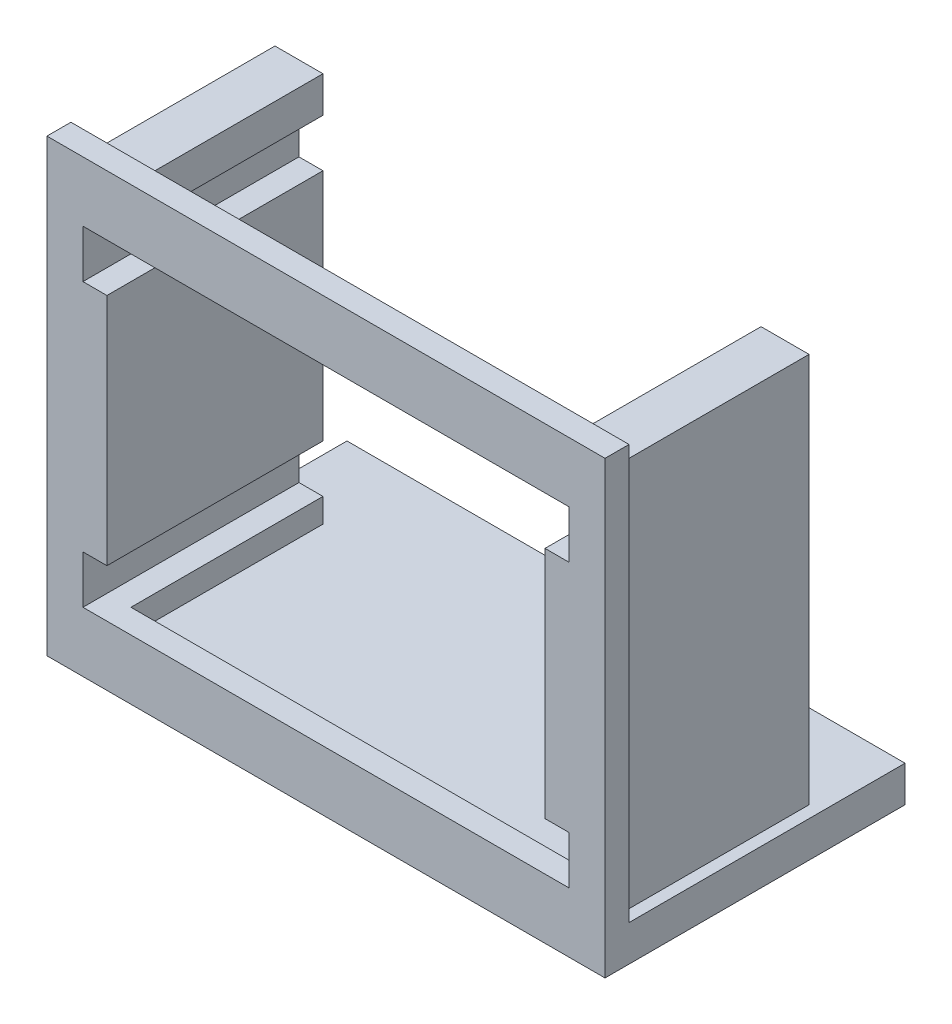
ISO-10303-21;
HEADER;
FILE_DESCRIPTION(('STEP AP214'),'2;1');
FILE_NAME('part.step','',(''),(''),'','','');
FILE_SCHEMA(('AUTOMOTIVE_DESIGN { 1 0 10303 214 1 1 1 1 }'));
ENDSEC;
DATA;
#1=APPLICATION_CONTEXT('core data for automotive mechanical design processes');
#2=APPLICATION_PROTOCOL_DEFINITION('international standard','automotive_design',2000,#1);
#3=PRODUCT_CONTEXT('',#1,'mechanical');
#4=PRODUCT('Part','Part','',(#3));
#5=PRODUCT_RELATED_PRODUCT_CATEGORY('part','',(#4));
#6=PRODUCT_DEFINITION_FORMATION('','',#4);
#7=PRODUCT_DEFINITION_CONTEXT('part definition',#1,'design');
#8=PRODUCT_DEFINITION('design','',#6,#7);
#9=PRODUCT_DEFINITION_SHAPE('','',#8);
#10=(LENGTH_UNIT() NAMED_UNIT(*) SI_UNIT(.MILLI.,.METRE.));
#11=(NAMED_UNIT(*) PLANE_ANGLE_UNIT() SI_UNIT($,.RADIAN.));
#12=(NAMED_UNIT(*) SI_UNIT($,.STERADIAN.) SOLID_ANGLE_UNIT());
#13=UNCERTAINTY_MEASURE_WITH_UNIT(LENGTH_MEASURE(1.E-05),#10,'distance_accuracy_value','');
#14=(GEOMETRIC_REPRESENTATION_CONTEXT(3) GLOBAL_UNCERTAINTY_ASSIGNED_CONTEXT((#13)) GLOBAL_UNIT_ASSIGNED_CONTEXT((#10,
#11,#12)) REPRESENTATION_CONTEXT('',''));
#15=CARTESIAN_POINT('',(0.,0.,0.));
#16=DIRECTION('',(0.,0.,1.));
#17=DIRECTION('',(1.,0.,0.));
#18=AXIS2_PLACEMENT_3D('',#15,#16,#17);
#19=CARTESIAN_POINT('',(-23.25,11.99,50.));
#20=DIRECTION('',(0.,0.,-1.));
#21=DIRECTION('',(-1.,0.,0.));
#22=AXIS2_PLACEMENT_3D('',#19,#20,#21);
#23=PLANE('',#22);
#24=DIRECTION('',(1.,0.,0.));
#25=VECTOR('',#24,1.);
#26=CARTESIAN_POINT('',(-23.25,12.,50.));
#27=LINE('',#26,#25);
#28=CARTESIAN_POINT('',(-23.25,12.,50.));
#29=VERTEX_POINT('',#28);
#30=CARTESIAN_POINT('',(23.25,12.,50.));
#31=VERTEX_POINT('',#30);
#32=EDGE_CURVE('E619',#29,#31,#27,.T.);
#33=ORIENTED_EDGE('',*,*,#32,.F.);
#34=DIRECTION('',(0.,-1.,0.));
#35=VECTOR('',#34,1.);
#36=CARTESIAN_POINT('',(-23.25,49.5,50.));
#37=LINE('',#36,#35);
#38=CARTESIAN_POINT('',(-23.25,15.,50.));
#39=VERTEX_POINT('',#38);
#40=EDGE_CURVE('E610',#39,#29,#37,.T.);
#41=ORIENTED_EDGE('',*,*,#40,.F.);
#42=DIRECTION('',(-1.,0.,0.));
#43=VECTOR('',#42,1.);
#44=CARTESIAN_POINT('',(0.,15.,50.));
#45=LINE('',#44,#43);
#46=CARTESIAN_POINT('',(23.25,15.,50.));
#47=VERTEX_POINT('',#46);
#48=EDGE_CURVE('E632',#47,#39,#45,.T.);
#49=ORIENTED_EDGE('',*,*,#48,.F.);
#50=DIRECTION('',(0.,1.,0.));
#51=VECTOR('',#50,1.);
#52=CARTESIAN_POINT('',(23.25,49.5,50.));
#53=LINE('',#52,#51);
#54=EDGE_CURVE('E618',#31,#47,#53,.T.);
#55=ORIENTED_EDGE('',*,*,#54,.F.);
#56=EDGE_LOOP('',(#33,#41,#49,#55));
#57=FACE_BOUND('',#56,.T.);
#58=ADVANCED_FACE('F409',(#57),#23,.T.);
#59=CARTESIAN_POINT('',(23.25,49.5,-75.01));
#60=DIRECTION('',(1.,0.,0.));
#61=DIRECTION('',(0.,0.,-1.));
#62=AXIS2_PLACEMENT_3D('',#59,#60,#61);
#63=PLANE('',#62);
#64=DIRECTION('',(0.,0.,1.));
#65=VECTOR('',#64,1.);
#66=CARTESIAN_POINT('',(23.25,12.,-75.01));
#67=LINE('',#66,#65);
#68=CARTESIAN_POINT('',(23.25,12.,75.));
#69=VERTEX_POINT('',#68);
#70=EDGE_CURVE('E631',#31,#69,#67,.T.);
#71=ORIENTED_EDGE('',*,*,#70,.F.);
#72=ORIENTED_EDGE('',*,*,#54,.T.);
#73=DIRECTION('',(0.,0.,-1.));
#74=VECTOR('',#73,1.);
#75=CARTESIAN_POINT('',(23.25,15.,0.));
#76=LINE('',#75,#74);
#77=CARTESIAN_POINT('',(23.25,15.,73.));
#78=VERTEX_POINT('',#77);
#79=EDGE_CURVE('E413',#78,#47,#76,.T.);
#80=ORIENTED_EDGE('',*,*,#79,.F.);
#81=DIRECTION('',(0.,-1.,0.));
#82=VECTOR('',#81,1.);
#83=CARTESIAN_POINT('',(23.25,80.,73.));
#84=LINE('',#83,#82);
#85=CARTESIAN_POINT('',(23.25,49.5,73.));
#86=VERTEX_POINT('',#85);
#87=EDGE_CURVE('E644',#86,#78,#84,.T.);
#88=ORIENTED_EDGE('',*,*,#87,.F.);
#89=DIRECTION('',(0.,0.,1.));
#90=VECTOR('',#89,1.);
#91=CARTESIAN_POINT('',(23.25,49.5,-75.01));
#92=LINE('',#91,#90);
#93=CARTESIAN_POINT('',(23.25,49.5,75.));
#94=VERTEX_POINT('',#93);
#95=EDGE_CURVE('E427',#86,#94,#92,.T.);
#96=ORIENTED_EDGE('',*,*,#95,.T.);
#97=DIRECTION('',(0.,-1.,0.));
#98=VECTOR('',#97,1.);
#99=CARTESIAN_POINT('',(23.25,80.,75.));
#100=LINE('',#99,#98);
#101=EDGE_CURVE('E649',#94,#69,#100,.T.);
#102=ORIENTED_EDGE('',*,*,#101,.T.);
#103=EDGE_LOOP('',(#71,#72,#80,#88,#96,#102));
#104=FACE_BOUND('',#103,.T.);
#105=ADVANCED_FACE('F921',(#104),#63,.T.);
#106=CARTESIAN_POINT('',(-18.25,44.5,27.2998905909406));
#107=DIRECTION('',(-1.,0.,0.));
#108=DIRECTION('',(0.,-1.,0.));
#109=AXIS2_PLACEMENT_3D('',#106,#107,#108);
#110=PLANE('',#109);
#111=DIRECTION('',(0.,0.,1.));
#112=VECTOR('',#111,1.);
#113=CARTESIAN_POINT('',(-18.25,40.5,27.2998905909406));
#114=LINE('',#113,#112);
#115=CARTESIAN_POINT('',(-18.25,40.5,57.));
#116=VERTEX_POINT('',#115);
#117=CARTESIAN_POINT('',(-18.25,40.5,75.));
#118=VERTEX_POINT('',#117);
#119=EDGE_CURVE('E863',#116,#118,#114,.T.);
#120=ORIENTED_EDGE('',*,*,#119,.T.);
#121=DIRECTION('',(0.,-1.,0.));
#122=VECTOR('',#121,1.);
#123=CARTESIAN_POINT('',(-18.25,44.5,75.));
#124=LINE('',#123,#122);
#125=CARTESIAN_POINT('',(-18.25,21.,75.));
#126=VERTEX_POINT('',#125);
#127=EDGE_CURVE('E838',#118,#126,#124,.T.);
#128=ORIENTED_EDGE('',*,*,#127,.T.);
#129=DIRECTION('',(0.,0.,1.));
#130=VECTOR('',#129,1.);
#131=CARTESIAN_POINT('',(-18.25,21.,27.2998905909406));
#132=LINE('',#131,#130);
#133=CARTESIAN_POINT('',(-18.25,21.,57.));
#134=VERTEX_POINT('',#133);
#135=EDGE_CURVE('E829',#134,#126,#132,.T.);
#136=ORIENTED_EDGE('',*,*,#135,.F.);
#137=DIRECTION('',(0.,-1.,0.));
#138=VECTOR('',#137,1.);
#139=CARTESIAN_POINT('',(-18.25,21.,57.));
#140=LINE('',#139,#138);
#141=EDGE_CURVE('E682',#116,#134,#140,.T.);
#142=ORIENTED_EDGE('',*,*,#141,.F.);
#143=EDGE_LOOP('',(#120,#128,#136,#142));
#144=FACE_BOUND('',#143,.T.);
#145=ADVANCED_FACE('F1000',(#144),#110,.F.);
#146=CARTESIAN_POINT('',(-20.25,40.5,27.2998905909406));
#147=DIRECTION('',(0.,-1.,0.));
#148=DIRECTION('',(0.,0.,-1.));
#149=AXIS2_PLACEMENT_3D('',#146,#147,#148);
#150=PLANE('',#149);
#151=DIRECTION('',(0.,0.,1.));
#152=VECTOR('',#151,1.);
#153=CARTESIAN_POINT('',(-20.25,40.5,27.2998905909406));
#154=LINE('',#153,#152);
#155=CARTESIAN_POINT('',(-20.25,40.5,57.));
#156=VERTEX_POINT('',#155);
#157=CARTESIAN_POINT('',(-20.25,40.5,75.));
#158=VERTEX_POINT('',#157);
#159=EDGE_CURVE('E849',#156,#158,#154,.T.);
#160=ORIENTED_EDGE('',*,*,#159,.T.);
#161=DIRECTION('',(1.,0.,0.));
#162=VECTOR('',#161,1.);
#163=CARTESIAN_POINT('',(-20.25,40.5,75.));
#164=LINE('',#163,#162);
#165=EDGE_CURVE('E850',#158,#118,#164,.T.);
#166=ORIENTED_EDGE('',*,*,#165,.T.);
#167=ORIENTED_EDGE('',*,*,#119,.F.);
#168=DIRECTION('',(1.,0.,0.));
#169=VECTOR('',#168,1.);
#170=CARTESIAN_POINT('',(-18.25,40.5,57.));
#171=LINE('',#170,#169);
#172=EDGE_CURVE('E678',#156,#116,#171,.T.);
#173=ORIENTED_EDGE('',*,*,#172,.F.);
#174=EDGE_LOOP('',(#160,#166,#167,#173));
#175=FACE_BOUND('',#174,.T.);
#176=ADVANCED_FACE('F995',(#175),#150,.F.);
#177=CARTESIAN_POINT('',(-20.25,44.5,27.2998905909406));
#178=DIRECTION('',(-1.,0.,0.));
#179=DIRECTION('',(0.,0.,1.));
#180=AXIS2_PLACEMENT_3D('',#177,#178,#179);
#181=PLANE('',#180);
#182=DIRECTION('',(0.,0.,1.));
#183=VECTOR('',#182,1.);
#184=CARTESIAN_POINT('',(-20.25,44.5,27.2998905909406));
#185=LINE('',#184,#183);
#186=CARTESIAN_POINT('',(-20.25,44.5,57.));
#187=VERTEX_POINT('',#186);
#188=CARTESIAN_POINT('',(-20.25,44.5,75.));
#189=VERTEX_POINT('',#188);
#190=EDGE_CURVE('E854',#187,#189,#185,.T.);
#191=ORIENTED_EDGE('',*,*,#190,.T.);
#192=DIRECTION('',(0.,-1.,0.));
#193=VECTOR('',#192,1.);
#194=CARTESIAN_POINT('',(-20.25,44.5,75.));
#195=LINE('',#194,#193);
#196=EDGE_CURVE('E855',#189,#158,#195,.T.);
#197=ORIENTED_EDGE('',*,*,#196,.T.);
#198=ORIENTED_EDGE('',*,*,#159,.F.);
#199=DIRECTION('',(0.,-1.,0.));
#200=VECTOR('',#199,1.);
#201=CARTESIAN_POINT('',(-20.25,40.5,57.));
#202=LINE('',#201,#200);
#203=EDGE_CURVE('E674',#187,#156,#202,.T.);
#204=ORIENTED_EDGE('',*,*,#203,.F.);
#205=EDGE_LOOP('',(#191,#197,#198,#204));
#206=FACE_BOUND('',#205,.T.);
#207=ADVANCED_FACE('F991',(#206),#181,.F.);
#208=CARTESIAN_POINT('',(20.25,44.5,27.2998905909406));
#209=DIRECTION('',(-1.,0.,0.));
#210=DIRECTION('',(0.,0.,1.));
#211=AXIS2_PLACEMENT_3D('',#208,#209,#210);
#212=PLANE('',#211);
#213=DIRECTION('',(0.,0.,1.));
#214=VECTOR('',#213,1.);
#215=CARTESIAN_POINT('',(20.25,44.5,27.2998905909406));
#216=LINE('',#215,#214);
#217=CARTESIAN_POINT('',(20.25,44.5,57.));
#218=VERTEX_POINT('',#217);
#219=CARTESIAN_POINT('',(20.25,44.5,75.));
#220=VERTEX_POINT('',#219);
#221=EDGE_CURVE('E893',#218,#220,#216,.T.);
#222=ORIENTED_EDGE('',*,*,#221,.F.);
#223=DIRECTION('',(0.,1.,0.));
#224=VECTOR('',#223,1.);
#225=CARTESIAN_POINT('',(20.25,44.5,57.));
#226=LINE('',#225,#224);
#227=CARTESIAN_POINT('',(20.25,40.5,57.));
#228=VERTEX_POINT('',#227);
#229=EDGE_CURVE('E777',#228,#218,#226,.T.);
#230=ORIENTED_EDGE('',*,*,#229,.F.);
#231=DIRECTION('',(0.,0.,1.));
#232=VECTOR('',#231,1.);
#233=CARTESIAN_POINT('',(20.25,40.5,27.2998905909406));
#234=LINE('',#233,#232);
#235=CARTESIAN_POINT('',(20.25,40.5,75.));
#236=VERTEX_POINT('',#235);
#237=EDGE_CURVE('E888',#228,#236,#234,.T.);
#238=ORIENTED_EDGE('',*,*,#237,.T.);
#239=DIRECTION('',(0.,-1.,0.));
#240=VECTOR('',#239,1.);
#241=CARTESIAN_POINT('',(20.25,44.5,75.));
#242=LINE('',#241,#240);
#243=EDGE_CURVE('E889',#220,#236,#242,.T.);
#244=ORIENTED_EDGE('',*,*,#243,.F.);
#245=EDGE_LOOP('',(#222,#230,#238,#244));
#246=FACE_BOUND('',#245,.T.);
#247=ADVANCED_FACE('F1029',(#246),#212,.T.);
#248=CARTESIAN_POINT('',(20.25,40.5,27.2998905909406));
#249=DIRECTION('',(0.,1.,0.));
#250=DIRECTION('',(0.,0.,1.));
#251=AXIS2_PLACEMENT_3D('',#248,#249,#250);
#252=PLANE('',#251);
#253=ORIENTED_EDGE('',*,*,#237,.F.);
#254=DIRECTION('',(1.,0.,0.));
#255=VECTOR('',#254,1.);
#256=CARTESIAN_POINT('',(20.25,40.5,57.));
#257=LINE('',#256,#255);
#258=CARTESIAN_POINT('',(18.25,40.5,57.));
#259=VERTEX_POINT('',#258);
#260=EDGE_CURVE('E772',#259,#228,#257,.T.);
#261=ORIENTED_EDGE('',*,*,#260,.F.);
#262=DIRECTION('',(0.,0.,1.));
#263=VECTOR('',#262,1.);
#264=CARTESIAN_POINT('',(18.25,40.5,27.2998905909406));
#265=LINE('',#264,#263);
#266=CARTESIAN_POINT('',(18.25,40.5,75.));
#267=VERTEX_POINT('',#266);
#268=EDGE_CURVE('E899',#259,#267,#265,.T.);
#269=ORIENTED_EDGE('',*,*,#268,.T.);
#270=DIRECTION('',(-1.,0.,0.));
#271=VECTOR('',#270,1.);
#272=CARTESIAN_POINT('',(20.25,40.5,75.));
#273=LINE('',#272,#271);
#274=EDGE_CURVE('E880',#236,#267,#273,.T.);
#275=ORIENTED_EDGE('',*,*,#274,.F.);
#276=EDGE_LOOP('',(#253,#261,#269,#275));
#277=FACE_BOUND('',#276,.T.);
#278=ADVANCED_FACE('F1026',(#277),#252,.T.);
#279=CARTESIAN_POINT('',(18.25,44.5,27.2998905909406));
#280=DIRECTION('',(-1.,0.,0.));
#281=DIRECTION('',(0.,0.,1.));
#282=AXIS2_PLACEMENT_3D('',#279,#280,#281);
#283=PLANE('',#282);
#284=ORIENTED_EDGE('',*,*,#268,.F.);
#285=DIRECTION('',(0.,1.,0.));
#286=VECTOR('',#285,1.);
#287=CARTESIAN_POINT('',(18.25,40.5,57.));
#288=LINE('',#287,#286);
#289=CARTESIAN_POINT('',(18.25,21.,57.));
#290=VERTEX_POINT('',#289);
#291=EDGE_CURVE('E788',#290,#259,#288,.T.);
#292=ORIENTED_EDGE('',*,*,#291,.F.);
#293=DIRECTION('',(0.,0.,1.));
#294=VECTOR('',#293,1.);
#295=CARTESIAN_POINT('',(18.25,21.,27.2998905909406));
#296=LINE('',#295,#294);
#297=CARTESIAN_POINT('',(18.25,21.,75.));
#298=VERTEX_POINT('',#297);
#299=EDGE_CURVE('E866',#290,#298,#296,.T.);
#300=ORIENTED_EDGE('',*,*,#299,.T.);
#301=DIRECTION('',(0.,-1.,0.));
#302=VECTOR('',#301,1.);
#303=CARTESIAN_POINT('',(18.25,44.5,75.));
#304=LINE('',#303,#302);
#305=EDGE_CURVE('E830',#267,#298,#304,.T.);
#306=ORIENTED_EDGE('',*,*,#305,.F.);
#307=EDGE_LOOP('',(#284,#292,#300,#306));
#308=FACE_BOUND('',#307,.T.);
#309=ADVANCED_FACE('F1023',(#308),#283,.T.);
#310=CARTESIAN_POINT('',(20.25,21.,27.2998905909406));
#311=DIRECTION('',(0.,1.,0.));
#312=DIRECTION('',(0.,0.,1.));
#313=AXIS2_PLACEMENT_3D('',#310,#311,#312);
#314=PLANE('',#313);
#315=DIRECTION('',(0.,0.,1.));
#316=VECTOR('',#315,1.);
#317=CARTESIAN_POINT('',(20.25,21.,27.2998905909406));
#318=LINE('',#317,#316);
#319=CARTESIAN_POINT('',(20.25,21.,57.));
#320=VERTEX_POINT('',#319);
#321=CARTESIAN_POINT('',(20.25,21.,75.));
#322=VERTEX_POINT('',#321);
#323=EDGE_CURVE('E908',#320,#322,#318,.T.);
#324=ORIENTED_EDGE('',*,*,#323,.T.);
#325=DIRECTION('',(-1.,0.,0.));
#326=VECTOR('',#325,1.);
#327=CARTESIAN_POINT('',(20.25,21.,75.));
#328=LINE('',#327,#326);
#329=EDGE_CURVE('E904',#322,#298,#328,.T.);
#330=ORIENTED_EDGE('',*,*,#329,.T.);
#331=ORIENTED_EDGE('',*,*,#299,.F.);
#332=DIRECTION('',(-1.,0.,0.));
#333=VECTOR('',#332,1.);
#334=CARTESIAN_POINT('',(18.25,21.,57.));
#335=LINE('',#334,#333);
#336=EDGE_CURVE('E792',#320,#290,#335,.T.);
#337=ORIENTED_EDGE('',*,*,#336,.F.);
#338=EDGE_LOOP('',(#324,#330,#331,#337));
#339=FACE_BOUND('',#338,.T.);
#340=ADVANCED_FACE('F1018',(#339),#314,.F.);
#341=CARTESIAN_POINT('',(20.25,17.,27.2998905909406));
#342=DIRECTION('',(1.,0.,0.));
#343=DIRECTION('',(0.,0.,-1.));
#344=AXIS2_PLACEMENT_3D('',#341,#342,#343);
#345=PLANE('',#344);
#346=DIRECTION('',(0.,0.,1.));
#347=VECTOR('',#346,1.);
#348=CARTESIAN_POINT('',(20.25,17.,27.2998905909406));
#349=LINE('',#348,#347);
#350=CARTESIAN_POINT('',(20.25,17.,57.));
#351=VERTEX_POINT('',#350);
#352=CARTESIAN_POINT('',(20.25,17.,75.));
#353=VERTEX_POINT('',#352);
#354=EDGE_CURVE('E896',#351,#353,#349,.T.);
#355=ORIENTED_EDGE('',*,*,#354,.T.);
#356=DIRECTION('',(0.,1.,0.));
#357=VECTOR('',#356,1.);
#358=CARTESIAN_POINT('',(20.25,17.,75.));
#359=LINE('',#358,#357);
#360=EDGE_CURVE('E750',#353,#322,#359,.T.);
#361=ORIENTED_EDGE('',*,*,#360,.T.);
#362=ORIENTED_EDGE('',*,*,#323,.F.);
#363=DIRECTION('',(0.,1.,0.));
#364=VECTOR('',#363,1.);
#365=CARTESIAN_POINT('',(20.25,21.,57.));
#366=LINE('',#365,#364);
#367=EDGE_CURVE('E796',#351,#320,#366,.T.);
#368=ORIENTED_EDGE('',*,*,#367,.F.);
#369=EDGE_LOOP('',(#355,#361,#362,#368));
#370=FACE_BOUND('',#369,.T.);
#371=ADVANCED_FACE('F1013',(#370),#345,.F.);
#372=CARTESIAN_POINT('',(-20.25,21.,27.2998905909406));
#373=DIRECTION('',(0.,-1.,0.));
#374=DIRECTION('',(0.,0.,-1.));
#375=AXIS2_PLACEMENT_3D('',#372,#373,#374);
#376=PLANE('',#375);
#377=DIRECTION('',(0.,0.,1.));
#378=VECTOR('',#377,1.);
#379=CARTESIAN_POINT('',(-20.25,21.,27.2998905909406));
#380=LINE('',#379,#378);
#381=CARTESIAN_POINT('',(-20.25,21.,57.));
#382=VERTEX_POINT('',#381);
#383=CARTESIAN_POINT('',(-20.25,21.,75.));
#384=VERTEX_POINT('',#383);
#385=EDGE_CURVE('E872',#382,#384,#380,.T.);
#386=ORIENTED_EDGE('',*,*,#385,.F.);
#387=DIRECTION('',(-1.,0.,0.));
#388=VECTOR('',#387,1.);
#389=CARTESIAN_POINT('',(-20.25,21.,57.));
#390=LINE('',#389,#388);
#391=EDGE_CURVE('E686',#134,#382,#390,.T.);
#392=ORIENTED_EDGE('',*,*,#391,.F.);
#393=ORIENTED_EDGE('',*,*,#135,.T.);
#394=DIRECTION('',(1.,0.,0.));
#395=VECTOR('',#394,1.);
#396=CARTESIAN_POINT('',(-20.25,21.,75.));
#397=LINE('',#396,#395);
#398=EDGE_CURVE('E859',#384,#126,#397,.T.);
#399=ORIENTED_EDGE('',*,*,#398,.F.);
#400=EDGE_LOOP('',(#386,#392,#393,#399));
#401=FACE_BOUND('',#400,.T.);
#402=ADVANCED_FACE('F1003',(#401),#376,.T.);
#403=CARTESIAN_POINT('',(0.,0.,57.));
#404=DIRECTION('',(0.,0.,-1.));
#405=DIRECTION('',(-1.,0.,0.));
#406=AXIS2_PLACEMENT_3D('',#403,#404,#405);
#407=PLANE('',#406);
#408=ORIENTED_EDGE('',*,*,#229,.T.);
#409=DIRECTION('',(-1.,0.,0.));
#410=VECTOR('',#409,1.);
#411=CARTESIAN_POINT('',(18.25,44.5,57.));
#412=LINE('',#411,#410);
#413=CARTESIAN_POINT('',(18.25,44.5,57.));
#414=VERTEX_POINT('',#413);
#415=EDGE_CURVE('E819',#218,#414,#412,.T.);
#416=ORIENTED_EDGE('',*,*,#415,.T.);
#417=DIRECTION('',(0.,1.,0.));
#418=VECTOR('',#417,1.);
#419=CARTESIAN_POINT('',(18.25,47.5,57.));
#420=LINE('',#419,#418);
#421=CARTESIAN_POINT('',(18.25,47.5,57.));
#422=VERTEX_POINT('',#421);
#423=EDGE_CURVE('E816',#414,#422,#420,.T.);
#424=ORIENTED_EDGE('',*,*,#423,.T.);
#425=DIRECTION('',(1.,0.,0.));
#426=VECTOR('',#425,1.);
#427=CARTESIAN_POINT('',(22.25,47.5,57.));
#428=LINE('',#427,#426);
#429=CARTESIAN_POINT('',(22.25,47.5,57.));
#430=VERTEX_POINT('',#429);
#431=EDGE_CURVE('E813',#422,#430,#428,.T.);
#432=ORIENTED_EDGE('',*,*,#431,.T.);
#433=DIRECTION('',(0.,-1.,0.));
#434=VECTOR('',#433,1.);
#435=CARTESIAN_POINT('',(22.25,47.5,57.));
#436=LINE('',#435,#434);
#437=CARTESIAN_POINT('',(22.25,15.,57.));
#438=VERTEX_POINT('',#437);
#439=EDGE_CURVE('E810',#430,#438,#436,.T.);
#440=ORIENTED_EDGE('',*,*,#439,.T.);
#441=DIRECTION('',(-1.,0.,0.));
#442=VECTOR('',#441,1.);
#443=CARTESIAN_POINT('',(18.25,15.,57.));
#444=LINE('',#443,#442);
#445=CARTESIAN_POINT('',(18.25,15.,57.));
#446=VERTEX_POINT('',#445);
#447=EDGE_CURVE('E807',#438,#446,#444,.T.);
#448=ORIENTED_EDGE('',*,*,#447,.T.);
#449=DIRECTION('',(0.,1.,0.));
#450=VECTOR('',#449,1.);
#451=CARTESIAN_POINT('',(18.25,17.,57.));
#452=LINE('',#451,#450);
#453=CARTESIAN_POINT('',(18.25,17.,57.));
#454=VERTEX_POINT('',#453);
#455=EDGE_CURVE('E804',#446,#454,#452,.T.);
#456=ORIENTED_EDGE('',*,*,#455,.T.);
#457=DIRECTION('',(1.,0.,0.));
#458=VECTOR('',#457,1.);
#459=CARTESIAN_POINT('',(20.25,17.,57.));
#460=LINE('',#459,#458);
#461=EDGE_CURVE('E800',#454,#351,#460,.T.);
#462=ORIENTED_EDGE('',*,*,#461,.T.);
#463=ORIENTED_EDGE('',*,*,#367,.T.);
#464=ORIENTED_EDGE('',*,*,#336,.T.);
#465=ORIENTED_EDGE('',*,*,#291,.T.);
#466=ORIENTED_EDGE('',*,*,#260,.T.);
#467=EDGE_LOOP('',(#408,#416,#424,#432,#440,#448,#456,#462,#463,#464,#465,#466));
#468=FACE_BOUND('',#467,.T.);
#469=ADVANCED_FACE('F964',(#468),#407,.T.);
#470=CARTESIAN_POINT('',(18.25,17.,57.));
#471=DIRECTION('',(1.,0.,0.));
#472=DIRECTION('',(0.,1.,0.));
#473=AXIS2_PLACEMENT_3D('',#470,#471,#472);
#474=PLANE('',#473);
#475=DIRECTION('',(0.,1.,0.));
#476=VECTOR('',#475,1.);
#477=CARTESIAN_POINT('',(18.25,17.,73.));
#478=LINE('',#477,#476);
#479=CARTESIAN_POINT('',(18.25,15.,73.));
#480=VERTEX_POINT('',#479);
#481=CARTESIAN_POINT('',(18.25,17.,73.));
#482=VERTEX_POINT('',#481);
#483=EDGE_CURVE('E773',#480,#482,#478,.T.);
#484=ORIENTED_EDGE('',*,*,#483,.T.);
#485=DIRECTION('',(0.,0.,1.));
#486=VECTOR('',#485,1.);
#487=CARTESIAN_POINT('',(18.25,17.,57.));
#488=LINE('',#487,#486);
#489=EDGE_CURVE('E768',#454,#482,#488,.T.);
#490=ORIENTED_EDGE('',*,*,#489,.F.);
#491=ORIENTED_EDGE('',*,*,#455,.F.);
#492=DIRECTION('',(0.,0.,1.));
#493=VECTOR('',#492,1.);
#494=CARTESIAN_POINT('',(18.25,15.,57.));
#495=LINE('',#494,#493);
#496=EDGE_CURVE('E765',#446,#480,#495,.T.);
#497=ORIENTED_EDGE('',*,*,#496,.T.);
#498=EDGE_LOOP('',(#484,#490,#491,#497));
#499=FACE_BOUND('',#498,.T.);
#500=ADVANCED_FACE('F962',(#499),#474,.F.);
#501=CARTESIAN_POINT('',(-100.,80.,73.));
#502=DIRECTION('',(0.,0.,-1.));
#503=DIRECTION('',(-1.,0.,0.));
#504=AXIS2_PLACEMENT_3D('',#501,#502,#503);
#505=PLANE('',#504);
#506=DIRECTION('',(1.,0.,0.));
#507=VECTOR('',#506,1.);
#508=CARTESIAN_POINT('',(-100.,15.,73.));
#509=LINE('',#508,#507);
#510=CARTESIAN_POINT('',(-18.25,15.,73.));
#511=VERTEX_POINT('',#510);
#512=EDGE_CURVE('E928',#511,#480,#509,.T.);
#513=ORIENTED_EDGE('',*,*,#512,.F.);
#514=DIRECTION('',(0.,-1.,0.));
#515=VECTOR('',#514,1.);
#516=CARTESIAN_POINT('',(-18.25,15.,73.));
#517=LINE('',#516,#515);
#518=CARTESIAN_POINT('',(-18.25,17.,73.));
#519=VERTEX_POINT('',#518);
#520=EDGE_CURVE('E716',#519,#511,#517,.T.);
#521=ORIENTED_EDGE('',*,*,#520,.F.);
#522=DIRECTION('',(1.,0.,0.));
#523=VECTOR('',#522,1.);
#524=CARTESIAN_POINT('',(-18.25,17.,73.));
#525=LINE('',#524,#523);
#526=EDGE_CURVE('E834',#519,#482,#525,.T.);
#527=ORIENTED_EDGE('',*,*,#526,.T.);
#528=ORIENTED_EDGE('',*,*,#483,.F.);
#529=EDGE_LOOP('',(#513,#521,#527,#528));
#530=FACE_BOUND('',#529,.T.);
#531=ADVANCED_FACE('F951',(#530),#505,.T.);
#532=CARTESIAN_POINT('',(-18.25,15.,57.));
#533=DIRECTION('',(-1.,0.,0.));
#534=DIRECTION('',(0.,-1.,0.));
#535=AXIS2_PLACEMENT_3D('',#532,#533,#534);
#536=PLANE('',#535);
#537=ORIENTED_EDGE('',*,*,#520,.T.);
#538=DIRECTION('',(0.,0.,1.));
#539=VECTOR('',#538,1.);
#540=CARTESIAN_POINT('',(-18.25,15.,57.));
#541=LINE('',#540,#539);
#542=CARTESIAN_POINT('',(-18.25,15.,57.));
#543=VERTEX_POINT('',#542);
#544=EDGE_CURVE('E739',#543,#511,#541,.T.);
#545=ORIENTED_EDGE('',*,*,#544,.F.);
#546=DIRECTION('',(0.,-1.,0.));
#547=VECTOR('',#546,1.);
#548=CARTESIAN_POINT('',(-18.25,15.,57.));
#549=LINE('',#548,#547);
#550=CARTESIAN_POINT('',(-18.25,17.,57.));
#551=VERTEX_POINT('',#550);
#552=EDGE_CURVE('E697',#551,#543,#549,.T.);
#553=ORIENTED_EDGE('',*,*,#552,.F.);
#554=DIRECTION('',(0.,0.,1.));
#555=VECTOR('',#554,1.);
#556=CARTESIAN_POINT('',(-18.25,17.,57.));
#557=LINE('',#556,#555);
#558=EDGE_CURVE('E742',#551,#519,#557,.T.);
#559=ORIENTED_EDGE('',*,*,#558,.T.);
#560=EDGE_LOOP('',(#537,#545,#553,#559));
#561=FACE_BOUND('',#560,.T.);
#562=ADVANCED_FACE('F953',(#561),#536,.F.);
#563=CARTESIAN_POINT('',(0.,0.,57.));
#564=DIRECTION('',(0.,0.,-1.));
#565=DIRECTION('',(-1.,0.,0.));
#566=AXIS2_PLACEMENT_3D('',#563,#564,#565);
#567=PLANE('',#566);
#568=DIRECTION('',(0.,-1.,0.));
#569=VECTOR('',#568,1.);
#570=CARTESIAN_POINT('',(-18.25,44.5,57.));
#571=LINE('',#570,#569);
#572=CARTESIAN_POINT('',(-18.25,47.5,57.));
#573=VERTEX_POINT('',#572);
#574=CARTESIAN_POINT('',(-18.25,44.5,57.));
#575=VERTEX_POINT('',#574);
#576=EDGE_CURVE('E665',#573,#575,#571,.T.);
#577=ORIENTED_EDGE('',*,*,#576,.T.);
#578=DIRECTION('',(-1.,0.,0.));
#579=VECTOR('',#578,1.);
#580=CARTESIAN_POINT('',(-20.25,44.5,57.));
#581=LINE('',#580,#579);
#582=EDGE_CURVE('E669',#575,#187,#581,.T.);
#583=ORIENTED_EDGE('',*,*,#582,.T.);
#584=ORIENTED_EDGE('',*,*,#203,.T.);
#585=ORIENTED_EDGE('',*,*,#172,.T.);
#586=ORIENTED_EDGE('',*,*,#141,.T.);
#587=ORIENTED_EDGE('',*,*,#391,.T.);
#588=DIRECTION('',(0.,-1.,0.));
#589=VECTOR('',#588,1.);
#590=CARTESIAN_POINT('',(-20.25,17.,57.));
#591=LINE('',#590,#589);
#592=CARTESIAN_POINT('',(-20.25,17.,57.));
#593=VERTEX_POINT('',#592);
#594=EDGE_CURVE('E690',#382,#593,#591,.T.);
#595=ORIENTED_EDGE('',*,*,#594,.T.);
#596=DIRECTION('',(1.,0.,0.));
#597=VECTOR('',#596,1.);
#598=CARTESIAN_POINT('',(-18.25,17.,57.));
#599=LINE('',#598,#597);
#600=EDGE_CURVE('E694',#593,#551,#599,.T.);
#601=ORIENTED_EDGE('',*,*,#600,.T.);
#602=ORIENTED_EDGE('',*,*,#552,.T.);
#603=DIRECTION('',(-1.,0.,0.));
#604=VECTOR('',#603,1.);
#605=CARTESIAN_POINT('',(-18.25,15.,57.));
#606=LINE('',#605,#604);
#607=CARTESIAN_POINT('',(-22.25,15.,57.));
#608=VERTEX_POINT('',#607);
#609=EDGE_CURVE('E701',#543,#608,#606,.T.);
#610=ORIENTED_EDGE('',*,*,#609,.T.);
#611=DIRECTION('',(0.,1.,0.));
#612=VECTOR('',#611,1.);
#613=CARTESIAN_POINT('',(-22.25,47.5,57.));
#614=LINE('',#613,#612);
#615=CARTESIAN_POINT('',(-22.25,47.5,57.));
#616=VERTEX_POINT('',#615);
#617=EDGE_CURVE('E705',#608,#616,#614,.T.);
#618=ORIENTED_EDGE('',*,*,#617,.T.);
#619=DIRECTION('',(1.,0.,0.));
#620=VECTOR('',#619,1.);
#621=CARTESIAN_POINT('',(-22.25,47.5,57.));
#622=LINE('',#621,#620);
#623=EDGE_CURVE('E708',#616,#573,#622,.T.);
#624=ORIENTED_EDGE('',*,*,#623,.T.);
#625=EDGE_LOOP('',(#577,#583,#584,#585,#586,#587,#595,#601,#602,#610,#618,#624));
#626=FACE_BOUND('',#625,.T.);
#627=ADVANCED_FACE('F942',(#626),#567,.T.);
#628=CARTESIAN_POINT('',(-22.25,47.5,57.));
#629=DIRECTION('',(1.,0.,0.));
#630=DIRECTION('',(0.,1.,0.));
#631=AXIS2_PLACEMENT_3D('',#628,#629,#630);
#632=PLANE('',#631);
#633=DIRECTION('',(0.,1.,0.));
#634=VECTOR('',#633,1.);
#635=CARTESIAN_POINT('',(-22.25,47.5,73.));
#636=LINE('',#635,#634);
#637=CARTESIAN_POINT('',(-22.25,15.,73.));
#638=VERTEX_POINT('',#637);
#639=CARTESIAN_POINT('',(-22.25,47.5,73.));
#640=VERTEX_POINT('',#639);
#641=EDGE_CURVE('E721',#638,#640,#636,.T.);
#642=ORIENTED_EDGE('',*,*,#641,.T.);
#643=DIRECTION('',(0.,0.,1.));
#644=VECTOR('',#643,1.);
#645=CARTESIAN_POINT('',(-22.25,47.5,57.));
#646=LINE('',#645,#644);
#647=EDGE_CURVE('E731',#616,#640,#646,.T.);
#648=ORIENTED_EDGE('',*,*,#647,.F.);
#649=ORIENTED_EDGE('',*,*,#617,.F.);
#650=DIRECTION('',(0.,0.,1.));
#651=VECTOR('',#650,1.);
#652=CARTESIAN_POINT('',(-22.25,15.,57.));
#653=LINE('',#652,#651);
#654=EDGE_CURVE('E735',#608,#638,#653,.T.);
#655=ORIENTED_EDGE('',*,*,#654,.T.);
#656=EDGE_LOOP('',(#642,#648,#649,#655));
#657=FACE_BOUND('',#656,.T.);
#658=ADVANCED_FACE('F939',(#657),#632,.F.);
#659=CARTESIAN_POINT('',(-22.25,47.5,57.));
#660=DIRECTION('',(0.,-1.,0.));
#661=DIRECTION('',(1.,0.,0.));
#662=AXIS2_PLACEMENT_3D('',#659,#660,#661);
#663=PLANE('',#662);
#664=DIRECTION('',(1.,0.,0.));
#665=VECTOR('',#664,1.);
#666=CARTESIAN_POINT('',(-22.25,47.5,73.));
#667=LINE('',#666,#665);
#668=CARTESIAN_POINT('',(-18.25,47.5,73.));
#669=VERTEX_POINT('',#668);
#670=EDGE_CURVE('E670',#640,#669,#667,.T.);
#671=ORIENTED_EDGE('',*,*,#670,.T.);
#672=DIRECTION('',(0.,0.,1.));
#673=VECTOR('',#672,1.);
#674=CARTESIAN_POINT('',(-18.25,47.5,57.));
#675=LINE('',#674,#673);
#676=EDGE_CURVE('E711',#573,#669,#675,.T.);
#677=ORIENTED_EDGE('',*,*,#676,.F.);
#678=ORIENTED_EDGE('',*,*,#623,.F.);
#679=ORIENTED_EDGE('',*,*,#647,.T.);
#680=EDGE_LOOP('',(#671,#677,#678,#679));
#681=FACE_BOUND('',#680,.T.);
#682=ADVANCED_FACE('F985',(#681),#663,.F.);
#683=CARTESIAN_POINT('',(-18.25,44.5,57.));
#684=DIRECTION('',(-1.,0.,0.));
#685=DIRECTION('',(0.,-1.,0.));
#686=AXIS2_PLACEMENT_3D('',#683,#684,#685);
#687=PLANE('',#686);
#688=DIRECTION('',(0.,-1.,0.));
#689=VECTOR('',#688,1.);
#690=CARTESIAN_POINT('',(-18.25,44.5,73.));
#691=LINE('',#690,#689);
#692=CARTESIAN_POINT('',(-18.25,44.5,73.));
#693=VERTEX_POINT('',#692);
#694=EDGE_CURVE('E712',#669,#693,#691,.T.);
#695=ORIENTED_EDGE('',*,*,#694,.T.);
#696=DIRECTION('',(0.,0.,1.));
#697=VECTOR('',#696,1.);
#698=CARTESIAN_POINT('',(-18.25,44.5,57.));
#699=LINE('',#698,#697);
#700=EDGE_CURVE('E746',#575,#693,#699,.T.);
#701=ORIENTED_EDGE('',*,*,#700,.F.);
#702=ORIENTED_EDGE('',*,*,#576,.F.);
#703=ORIENTED_EDGE('',*,*,#676,.T.);
#704=EDGE_LOOP('',(#695,#701,#702,#703));
#705=FACE_BOUND('',#704,.T.);
#706=ADVANCED_FACE('F987',(#705),#687,.F.);
#707=CARTESIAN_POINT('',(-18.25,44.5,27.2998905909406));
#708=DIRECTION('',(0.,-1.,0.));
#709=DIRECTION('',(1.,0.,0.));
#710=AXIS2_PLACEMENT_3D('',#707,#708,#709);
#711=PLANE('',#710);
#712=ORIENTED_EDGE('',*,*,#190,.F.);
#713=ORIENTED_EDGE('',*,*,#582,.F.);
#714=ORIENTED_EDGE('',*,*,#700,.T.);
#715=DIRECTION('',(1.,0.,0.));
#716=VECTOR('',#715,1.);
#717=CARTESIAN_POINT('',(-18.25,44.5,73.));
#718=LINE('',#717,#716);
#719=CARTESIAN_POINT('',(18.25,44.5,73.));
#720=VERTEX_POINT('',#719);
#721=EDGE_CURVE('E842',#693,#720,#718,.T.);
#722=ORIENTED_EDGE('',*,*,#721,.T.);
#723=DIRECTION('',(0.,0.,1.));
#724=VECTOR('',#723,1.);
#725=CARTESIAN_POINT('',(18.25,44.5,57.));
#726=LINE('',#725,#724);
#727=EDGE_CURVE('E642',#414,#720,#726,.T.);
#728=ORIENTED_EDGE('',*,*,#727,.F.);
#729=ORIENTED_EDGE('',*,*,#415,.F.);
#730=ORIENTED_EDGE('',*,*,#221,.T.);
#731=DIRECTION('',(1.,0.,0.));
#732=VECTOR('',#731,1.);
#733=CARTESIAN_POINT('',(-18.25,44.5,75.));
#734=LINE('',#733,#732);
#735=EDGE_CURVE('E825',#189,#220,#734,.T.);
#736=ORIENTED_EDGE('',*,*,#735,.F.);
#737=EDGE_LOOP('',(#712,#713,#714,#722,#728,#729,#730,#736));
#738=FACE_BOUND('',#737,.T.);
#739=ADVANCED_FACE('F981',(#738),#711,.T.);
#740=CARTESIAN_POINT('',(18.25,47.5,57.));
#741=DIRECTION('',(1.,0.,0.));
#742=DIRECTION('',(0.,1.,0.));
#743=AXIS2_PLACEMENT_3D('',#740,#741,#742);
#744=PLANE('',#743);
#745=DIRECTION('',(0.,1.,0.));
#746=VECTOR('',#745,1.);
#747=CARTESIAN_POINT('',(18.25,47.5,73.));
#748=LINE('',#747,#746);
#749=CARTESIAN_POINT('',(18.25,47.5,73.));
#750=VERTEX_POINT('',#749);
#751=EDGE_CURVE('E717',#720,#750,#748,.T.);
#752=ORIENTED_EDGE('',*,*,#751,.T.);
#753=DIRECTION('',(0.,0.,1.));
#754=VECTOR('',#753,1.);
#755=CARTESIAN_POINT('',(18.25,47.5,57.));
#756=LINE('',#755,#754);
#757=EDGE_CURVE('E753',#422,#750,#756,.T.);
#758=ORIENTED_EDGE('',*,*,#757,.F.);
#759=ORIENTED_EDGE('',*,*,#423,.F.);
#760=ORIENTED_EDGE('',*,*,#727,.T.);
#761=EDGE_LOOP('',(#752,#758,#759,#760));
#762=FACE_BOUND('',#761,.T.);
#763=ADVANCED_FACE('F977',(#762),#744,.F.);
#764=CARTESIAN_POINT('',(22.25,47.5,57.));
#765=DIRECTION('',(0.,-1.,0.));
#766=DIRECTION('',(1.,0.,0.));
#767=AXIS2_PLACEMENT_3D('',#764,#765,#766);
#768=PLANE('',#767);
#769=DIRECTION('',(1.,0.,0.));
#770=VECTOR('',#769,1.);
#771=CARTESIAN_POINT('',(22.25,47.5,73.));
#772=LINE('',#771,#770);
#773=CARTESIAN_POINT('',(22.25,47.5,73.));
#774=VERTEX_POINT('',#773);
#775=EDGE_CURVE('E780',#750,#774,#772,.T.);
#776=ORIENTED_EDGE('',*,*,#775,.T.);
#777=DIRECTION('',(0.,0.,1.));
#778=VECTOR('',#777,1.);
#779=CARTESIAN_POINT('',(22.25,47.5,57.));
#780=LINE('',#779,#778);
#781=EDGE_CURVE('E757',#430,#774,#780,.T.);
#782=ORIENTED_EDGE('',*,*,#781,.F.);
#783=ORIENTED_EDGE('',*,*,#431,.F.);
#784=ORIENTED_EDGE('',*,*,#757,.T.);
#785=EDGE_LOOP('',(#776,#782,#783,#784));
#786=FACE_BOUND('',#785,.T.);
#787=ADVANCED_FACE('F973',(#786),#768,.F.);
#788=CARTESIAN_POINT('',(22.25,47.5,57.));
#789=DIRECTION('',(-1.,0.,0.));
#790=DIRECTION('',(0.,-1.,0.));
#791=AXIS2_PLACEMENT_3D('',#788,#789,#790);
#792=PLANE('',#791);
#793=DIRECTION('',(0.,-1.,0.));
#794=VECTOR('',#793,1.);
#795=CARTESIAN_POINT('',(22.25,47.5,73.));
#796=LINE('',#795,#794);
#797=CARTESIAN_POINT('',(22.25,15.,73.));
#798=VERTEX_POINT('',#797);
#799=EDGE_CURVE('E776',#774,#798,#796,.T.);
#800=ORIENTED_EDGE('',*,*,#799,.T.);
#801=DIRECTION('',(0.,0.,1.));
#802=VECTOR('',#801,1.);
#803=CARTESIAN_POINT('',(22.25,15.,57.));
#804=LINE('',#803,#802);
#805=EDGE_CURVE('E761',#438,#798,#804,.T.);
#806=ORIENTED_EDGE('',*,*,#805,.F.);
#807=ORIENTED_EDGE('',*,*,#439,.F.);
#808=ORIENTED_EDGE('',*,*,#781,.T.);
#809=EDGE_LOOP('',(#800,#806,#807,#808));
#810=FACE_BOUND('',#809,.T.);
#811=ADVANCED_FACE('F969',(#810),#792,.F.);
#812=CARTESIAN_POINT('',(0.,15.,0.));
#813=DIRECTION('',(0.,1.,0.));
#814=DIRECTION('',(0.,0.,1.));
#815=AXIS2_PLACEMENT_3D('',#812,#813,#814);
#816=PLANE('',#815);
#817=ORIENTED_EDGE('',*,*,#79,.T.);
#818=ORIENTED_EDGE('',*,*,#48,.T.);
#819=DIRECTION('',(0.,0.,1.));
#820=VECTOR('',#819,1.);
#821=CARTESIAN_POINT('',(-23.25,15.,0.));
#822=LINE('',#821,#820);
#823=CARTESIAN_POINT('',(-23.25,15.,73.));
#824=VERTEX_POINT('',#823);
#825=EDGE_CURVE('E615',#39,#824,#822,.T.);
#826=ORIENTED_EDGE('',*,*,#825,.T.);
#827=EDGE_CURVE('E664',#824,#638,#509,.T.);
#828=ORIENTED_EDGE('',*,*,#827,.T.);
#829=ORIENTED_EDGE('',*,*,#654,.F.);
#830=ORIENTED_EDGE('',*,*,#609,.F.);
#831=ORIENTED_EDGE('',*,*,#544,.T.);
#832=ORIENTED_EDGE('',*,*,#512,.T.);
#833=ORIENTED_EDGE('',*,*,#496,.F.);
#834=ORIENTED_EDGE('',*,*,#447,.F.);
#835=ORIENTED_EDGE('',*,*,#805,.T.);
#836=EDGE_CURVE('E903',#798,#78,#509,.T.);
#837=ORIENTED_EDGE('',*,*,#836,.T.);
#838=EDGE_LOOP('',(#817,#818,#826,#828,#829,#830,#831,#832,#833,#834,#835,#837));
#839=FACE_BOUND('',#838,.T.);
#840=ADVANCED_FACE('F411',(#839),#816,.T.);
#841=CARTESIAN_POINT('',(-23.25,49.5,-75.01));
#842=DIRECTION('',(0.,1.,0.));
#843=DIRECTION('',(0.,0.,1.));
#844=AXIS2_PLACEMENT_3D('',#841,#842,#843);
#845=PLANE('',#844);
#846=DIRECTION('',(1.,0.,0.));
#847=VECTOR('',#846,1.);
#848=CARTESIAN_POINT('',(-100.,49.5,73.));
#849=LINE('',#848,#847);
#850=CARTESIAN_POINT('',(-23.25,49.5,73.));
#851=VERTEX_POINT('',#850);
#852=EDGE_CURVE('E650',#851,#86,#849,.T.);
#853=ORIENTED_EDGE('',*,*,#852,.F.);
#854=DIRECTION('',(0.,0.,1.));
#855=VECTOR('',#854,1.);
#856=CARTESIAN_POINT('',(-23.25,49.5,-75.01));
#857=LINE('',#856,#855);
#858=CARTESIAN_POINT('',(-23.25,49.5,75.));
#859=VERTEX_POINT('',#858);
#860=EDGE_CURVE('E435',#851,#859,#857,.T.);
#861=ORIENTED_EDGE('',*,*,#860,.T.);
#862=DIRECTION('',(1.,0.,0.));
#863=VECTOR('',#862,1.);
#864=CARTESIAN_POINT('',(-100.,49.5,75.));
#865=LINE('',#864,#863);
#866=EDGE_CURVE('E1323',#859,#94,#865,.T.);
#867=ORIENTED_EDGE('',*,*,#866,.T.);
#868=ORIENTED_EDGE('',*,*,#95,.F.);
#869=EDGE_LOOP('',(#853,#861,#867,#868));
#870=FACE_BOUND('',#869,.T.);
#871=ADVANCED_FACE('F1070',(#870),#845,.T.);
#872=ORIENTED_EDGE('',*,*,#852,.T.);
#873=ORIENTED_EDGE('',*,*,#87,.T.);
#874=ORIENTED_EDGE('',*,*,#836,.F.);
#875=ORIENTED_EDGE('',*,*,#799,.F.);
#876=ORIENTED_EDGE('',*,*,#775,.F.);
#877=ORIENTED_EDGE('',*,*,#751,.F.);
#878=ORIENTED_EDGE('',*,*,#721,.F.);
#879=ORIENTED_EDGE('',*,*,#694,.F.);
#880=ORIENTED_EDGE('',*,*,#670,.F.);
#881=ORIENTED_EDGE('',*,*,#641,.F.);
#882=ORIENTED_EDGE('',*,*,#827,.F.);
#883=DIRECTION('',(0.,1.,0.));
#884=VECTOR('',#883,1.);
#885=CARTESIAN_POINT('',(-23.25,80.,73.));
#886=LINE('',#885,#884);
#887=EDGE_CURVE('E657',#824,#851,#886,.T.);
#888=ORIENTED_EDGE('',*,*,#887,.T.);
#889=EDGE_LOOP('',(#872,#873,#874,#875,#876,#877,#878,#879,#880,#881,#882,#888));
#890=FACE_BOUND('',#889,.T.);
#891=ADVANCED_FACE('F935',(#890),#505,.T.);
#892=CARTESIAN_POINT('',(-18.25,17.,27.2998905909406));
#893=DIRECTION('',(0.,-1.,0.));
#894=DIRECTION('',(1.,0.,0.));
#895=AXIS2_PLACEMENT_3D('',#892,#893,#894);
#896=PLANE('',#895);
#897=DIRECTION('',(1.,0.,0.));
#898=VECTOR('',#897,1.);
#899=CARTESIAN_POINT('',(-18.25,17.,75.));
#900=LINE('',#899,#898);
#901=CARTESIAN_POINT('',(-20.25,17.,75.));
#902=VERTEX_POINT('',#901);
#903=EDGE_CURVE('E835',#902,#353,#900,.T.);
#904=ORIENTED_EDGE('',*,*,#903,.T.);
#905=ORIENTED_EDGE('',*,*,#354,.F.);
#906=ORIENTED_EDGE('',*,*,#461,.F.);
#907=ORIENTED_EDGE('',*,*,#489,.T.);
#908=ORIENTED_EDGE('',*,*,#526,.F.);
#909=ORIENTED_EDGE('',*,*,#558,.F.);
#910=ORIENTED_EDGE('',*,*,#600,.F.);
#911=DIRECTION('',(0.,0.,1.));
#912=VECTOR('',#911,1.);
#913=CARTESIAN_POINT('',(-20.25,17.,27.2998905909406));
#914=LINE('',#913,#912);
#915=EDGE_CURVE('E877',#593,#902,#914,.T.);
#916=ORIENTED_EDGE('',*,*,#915,.T.);
#917=EDGE_LOOP('',(#904,#905,#906,#907,#908,#909,#910,#916));
#918=FACE_BOUND('',#917,.T.);
#919=ADVANCED_FACE('F957',(#918),#896,.F.);
#920=CARTESIAN_POINT('',(-20.25,17.,27.2998905909406));
#921=DIRECTION('',(1.,0.,0.));
#922=DIRECTION('',(0.,0.,-1.));
#923=AXIS2_PLACEMENT_3D('',#920,#921,#922);
#924=PLANE('',#923);
#925=ORIENTED_EDGE('',*,*,#915,.F.);
#926=ORIENTED_EDGE('',*,*,#594,.F.);
#927=ORIENTED_EDGE('',*,*,#385,.T.);
#928=DIRECTION('',(0.,1.,0.));
#929=VECTOR('',#928,1.);
#930=CARTESIAN_POINT('',(-20.25,17.,75.));
#931=LINE('',#930,#929);
#932=EDGE_CURVE('E873',#902,#384,#931,.T.);
#933=ORIENTED_EDGE('',*,*,#932,.F.);
#934=EDGE_LOOP('',(#925,#926,#927,#933));
#935=FACE_BOUND('',#934,.T.);
#936=ADVANCED_FACE('F1006',(#935),#924,.T.);
#937=CARTESIAN_POINT('',(-23.25,49.5,-75.01));
#938=DIRECTION('',(-1.,0.,0.));
#939=DIRECTION('',(0.,0.,1.));
#940=AXIS2_PLACEMENT_3D('',#937,#938,#939);
#941=PLANE('',#940);
#942=ORIENTED_EDGE('',*,*,#825,.F.);
#943=ORIENTED_EDGE('',*,*,#40,.T.);
#944=DIRECTION('',(0.,0.,1.));
#945=VECTOR('',#944,1.);
#946=CARTESIAN_POINT('',(-23.25,12.,-75.01));
#947=LINE('',#946,#945);
#948=CARTESIAN_POINT('',(-23.25,12.,75.));
#949=VERTEX_POINT('',#948);
#950=EDGE_CURVE('E614',#29,#949,#947,.T.);
#951=ORIENTED_EDGE('',*,*,#950,.T.);
#952=DIRECTION('',(0.,1.,0.));
#953=VECTOR('',#952,1.);
#954=CARTESIAN_POINT('',(-23.25,80.,75.));
#955=LINE('',#954,#953);
#956=EDGE_CURVE('E419',#949,#859,#955,.T.);
#957=ORIENTED_EDGE('',*,*,#956,.T.);
#958=ORIENTED_EDGE('',*,*,#860,.F.);
#959=ORIENTED_EDGE('',*,*,#887,.F.);
#960=EDGE_LOOP('',(#942,#943,#951,#957,#958,#959));
#961=FACE_BOUND('',#960,.T.);
#962=ADVANCED_FACE('F612',(#961),#941,.T.);
#963=CARTESIAN_POINT('',(-100.,80.,75.));
#964=DIRECTION('',(0.,0.,-1.));
#965=DIRECTION('',(-1.,0.,0.));
#966=AXIS2_PLACEMENT_3D('',#963,#964,#965);
#967=PLANE('',#966);
#968=ORIENTED_EDGE('',*,*,#398,.T.);
#969=ORIENTED_EDGE('',*,*,#127,.F.);
#970=ORIENTED_EDGE('',*,*,#165,.F.);
#971=ORIENTED_EDGE('',*,*,#196,.F.);
#972=ORIENTED_EDGE('',*,*,#735,.T.);
#973=ORIENTED_EDGE('',*,*,#243,.T.);
#974=ORIENTED_EDGE('',*,*,#274,.T.);
#975=ORIENTED_EDGE('',*,*,#305,.T.);
#976=ORIENTED_EDGE('',*,*,#329,.F.);
#977=ORIENTED_EDGE('',*,*,#360,.F.);
#978=ORIENTED_EDGE('',*,*,#903,.F.);
#979=ORIENTED_EDGE('',*,*,#932,.T.);
#980=EDGE_LOOP('',(#968,#969,#970,#971,#972,#973,#974,#975,#976,#977,#978,#979));
#981=FACE_BOUND('',#980,.T.);
#982=ORIENTED_EDGE('',*,*,#101,.F.);
#983=ORIENTED_EDGE('',*,*,#866,.F.);
#984=ORIENTED_EDGE('',*,*,#956,.F.);
#985=DIRECTION('',(-1.,0.,0.));
#986=VECTOR('',#985,1.);
#987=CARTESIAN_POINT('',(-100.,12.,75.));
#988=LINE('',#987,#986);
#989=EDGE_CURVE('E12',#69,#949,#988,.T.);
#990=ORIENTED_EDGE('',*,*,#989,.F.);
#991=EDGE_LOOP('',(#982,#983,#984,#990));
#992=FACE_BOUND('',#991,.T.);
#993=ADVANCED_FACE('F1015',(#981,#992),#967,.F.);
#994=CARTESIAN_POINT('',(-23.25,12.,-75.01));
#995=DIRECTION('',(0.,-1.,0.));
#996=DIRECTION('',(0.,0.,-1.));
#997=AXIS2_PLACEMENT_3D('',#994,#995,#996);
#998=PLANE('',#997);
#999=ORIENTED_EDGE('',*,*,#950,.F.);
#1000=ORIENTED_EDGE('',*,*,#32,.T.);
#1001=ORIENTED_EDGE('',*,*,#70,.T.);
#1002=ORIENTED_EDGE('',*,*,#989,.T.);
#1003=EDGE_LOOP('',(#999,#1000,#1001,#1002));
#1004=FACE_BOUND('',#1003,.T.);
#1005=ADVANCED_FACE('F627',(#1004),#998,.T.);
#1006=CLOSED_SHELL('',(#58,#105,#145,#176,#207,#247,#278,#309,#340,#371,#402,#469,#500,#531,
#562,#627,#658,#682,#706,#739,#763,#787,#811,#840,#871,#891,#919,#936,#962,#993,#1005));
#1007=MANIFOLD_SOLID_BREP('B2',#1006);
#1008=ADVANCED_BREP_SHAPE_REPRESENTATION('',(#18,#1007),#14);
#1009=SHAPE_DEFINITION_REPRESENTATION(#9,#1008);
ENDSEC;
END-ISO-10303-21;
